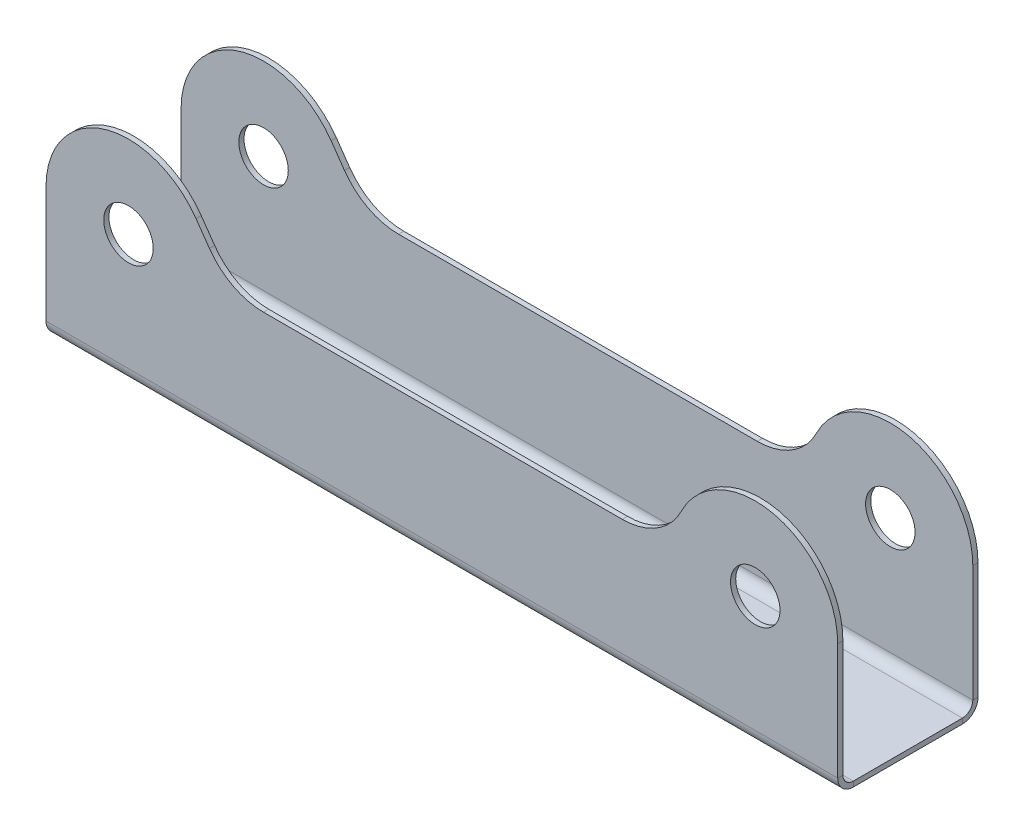
ISO-10303-21;
HEADER;
FILE_DESCRIPTION(('STEP AP214'),'2;1');
FILE_NAME('part.step','',(''),(''),'','','');
FILE_SCHEMA(('AUTOMOTIVE_DESIGN { 1 0 10303 214 1 1 1 1 }'));
ENDSEC;
DATA;
#1=APPLICATION_CONTEXT('core data for automotive mechanical design processes');
#2=APPLICATION_PROTOCOL_DEFINITION('international standard','automotive_design',2000,#1);
#3=PRODUCT_CONTEXT('',#1,'mechanical');
#4=PRODUCT('Part','Part','',(#3));
#5=PRODUCT_RELATED_PRODUCT_CATEGORY('part','',(#4));
#6=PRODUCT_DEFINITION_FORMATION('','',#4);
#7=PRODUCT_DEFINITION_CONTEXT('part definition',#1,'design');
#8=PRODUCT_DEFINITION('design','',#6,#7);
#9=PRODUCT_DEFINITION_SHAPE('','',#8);
#10=(LENGTH_UNIT() NAMED_UNIT(*) SI_UNIT(.MILLI.,.METRE.));
#11=(NAMED_UNIT(*) PLANE_ANGLE_UNIT() SI_UNIT($,.RADIAN.));
#12=(NAMED_UNIT(*) SI_UNIT($,.STERADIAN.) SOLID_ANGLE_UNIT());
#13=UNCERTAINTY_MEASURE_WITH_UNIT(LENGTH_MEASURE(1.E-05),#10,'distance_accuracy_value','');
#14=(GEOMETRIC_REPRESENTATION_CONTEXT(3) GLOBAL_UNCERTAINTY_ASSIGNED_CONTEXT((#13)) GLOBAL_UNIT_ASSIGNED_CONTEXT((#10,
#11,#12)) REPRESENTATION_CONTEXT('',''));
#15=CARTESIAN_POINT('',(0.,0.,0.));
#16=DIRECTION('',(0.,0.,1.));
#17=DIRECTION('',(1.,0.,0.));
#18=AXIS2_PLACEMENT_3D('',#15,#16,#17);
#19=CARTESIAN_POINT('',(120.65,0.,-13.5));
#20=DIRECTION('',(0.,0.,1.));
#21=DIRECTION('',(1.,0.,0.));
#22=AXIS2_PLACEMENT_3D('',#19,#20,#21);
#23=CYLINDRICAL_SURFACE('',#22,4.76250000000001);
#24=CARTESIAN_POINT('',(120.65,0.,-13.5));
#25=DIRECTION('',(0.,0.,1.));
#26=DIRECTION('',(1.,0.,0.));
#27=AXIS2_PLACEMENT_3D('',#24,#25,#26);
#28=CIRCLE('',#27,4.76250000000001);
#29=CARTESIAN_POINT('',(125.4125,0.,-13.5));
#30=VERTEX_POINT('',#29);
#31=EDGE_CURVE('E273',#30,#30,#28,.T.);
#32=ORIENTED_EDGE('',*,*,#31,.F.);
#33=EDGE_LOOP('',(#32));
#34=FACE_BOUND('',#33,.T.);
#35=CARTESIAN_POINT('',(120.65,0.,-12.5));
#36=DIRECTION('',(0.,0.,-1.));
#37=DIRECTION('',(-1.,0.,0.));
#38=AXIS2_PLACEMENT_3D('',#35,#36,#37);
#39=CIRCLE('',#38,4.76250000000001);
#40=CARTESIAN_POINT('',(115.8875,0.,-12.5));
#41=VERTEX_POINT('',#40);
#42=EDGE_CURVE('E304',#41,#41,#39,.T.);
#43=ORIENTED_EDGE('',*,*,#42,.F.);
#44=EDGE_LOOP('',(#43));
#45=FACE_BOUND('',#44,.T.);
#46=ADVANCED_FACE('F34',(#34,#45),#23,.F.);
#47=CARTESIAN_POINT('',(0.,0.,-13.5));
#48=DIRECTION('',(0.,0.,-1.));
#49=DIRECTION('',(-1.,0.,0.));
#50=AXIS2_PLACEMENT_3D('',#47,#48,#49);
#51=PLANE('',#50);
#52=DIRECTION('',(1.,0.,0.));
#53=VECTOR('',#52,1.);
#54=CARTESIAN_POINT('',(136.525,-22.4,-13.5));
#55=LINE('',#54,#53);
#56=CARTESIAN_POINT('',(-15.875,-22.4,-13.5));
#57=VERTEX_POINT('',#56);
#58=CARTESIAN_POINT('',(136.525,-22.4,-13.5));
#59=VERTEX_POINT('',#58);
#60=EDGE_CURVE('E198',#57,#59,#55,.T.);
#61=ORIENTED_EDGE('',*,*,#60,.F.);
#62=DIRECTION('',(0.,-1.,0.));
#63=VECTOR('',#62,1.);
#64=CARTESIAN_POINT('',(-15.875,0.,-13.5));
#65=LINE('',#64,#63);
#66=CARTESIAN_POINT('',(-15.875,0.,-13.5));
#67=VERTEX_POINT('',#66);
#68=EDGE_CURVE('E212',#67,#57,#65,.T.);
#69=ORIENTED_EDGE('',*,*,#68,.F.);
#70=CARTESIAN_POINT('',(0.,0.,-13.5));
#71=DIRECTION('',(0.,0.,-1.));
#72=DIRECTION('',(-1.,0.,0.));
#73=AXIS2_PLACEMENT_3D('',#70,#71,#72);
#74=CIRCLE('',#73,15.875);
#75=CARTESIAN_POINT('',(13.0040387030877,9.10552592707292,-13.5));
#76=VERTEX_POINT('',#75);
#77=EDGE_CURVE('E270',#67,#76,#74,.T.);
#78=ORIENTED_EDGE('',*,*,#77,.T.);
#79=DIRECTION('',(0.57357643635105,-0.819152044288989,0.));
#80=VECTOR('',#79,1.);
#81=CARTESIAN_POINT('',(13.0040387030877,9.10552592707292,-13.5));
#82=LINE('',#81,#80);
#83=CARTESIAN_POINT('',(15.5877671761251,5.41557925834168,-13.5));
#84=VERTEX_POINT('',#83);
#85=EDGE_CURVE('E266',#76,#84,#82,.T.);
#86=ORIENTED_EDGE('',*,*,#85,.T.);
#87=CARTESIAN_POINT('',(25.9909981385953,12.7,-13.5));
#88=DIRECTION('',(0.,0.,-1.));
#89=DIRECTION('',(-1.,0.,0.));
#90=AXIS2_PLACEMENT_3D('',#87,#88,#89);
#91=CIRCLE('',#90,12.7);
#92=CARTESIAN_POINT('',(25.9909981385953,0.,-13.5));
#93=VERTEX_POINT('',#92);
#94=EDGE_CURVE('E263',#84,#93,#91,.F.);
#95=ORIENTED_EDGE('',*,*,#94,.T.);
#96=DIRECTION('',(-1.,0.,0.));
#97=VECTOR('',#96,1.);
#98=CARTESIAN_POINT('',(103.756177861945,0.,-13.5));
#99=LINE('',#98,#97);
#100=CARTESIAN_POINT('',(95.0523316491521,0.,-13.5));
#101=VERTEX_POINT('',#100);
#102=EDGE_CURVE('E258',#101,#93,#99,.T.);
#103=ORIENTED_EDGE('',*,*,#102,.F.);
#104=CARTESIAN_POINT('',(95.0523316491521,12.7,-13.5));
#105=DIRECTION('',(0.,0.,-1.));
#106=DIRECTION('',(-1.,0.,0.));
#107=AXIS2_PLACEMENT_3D('',#104,#105,#106);
#108=CIRCLE('',#107,12.7);
#109=CARTESIAN_POINT('',(106.429073138418,7.05555555555557,-13.5));
#110=VERTEX_POINT('',#109);
#111=EDGE_CURVE('E251',#101,#110,#108,.F.);
#112=ORIENTED_EDGE('',*,*,#111,.T.);
#113=CARTESIAN_POINT('',(120.65,0.,-13.5));
#114=DIRECTION('',(0.,0.,1.));
#115=DIRECTION('',(1.,0.,0.));
#116=AXIS2_PLACEMENT_3D('',#113,#114,#115);
#117=CIRCLE('',#116,15.875);
#118=CARTESIAN_POINT('',(136.525,0.,-13.5));
#119=VERTEX_POINT('',#118);
#120=EDGE_CURVE('E55',#119,#110,#117,.T.);
#121=ORIENTED_EDGE('',*,*,#120,.F.);
#122=DIRECTION('',(0.,1.,0.));
#123=VECTOR('',#122,1.);
#124=CARTESIAN_POINT('',(136.525,-25.4,-13.5));
#125=LINE('',#124,#123);
#126=EDGE_CURVE('E48',#59,#119,#125,.T.);
#127=ORIENTED_EDGE('',*,*,#126,.F.);
#128=EDGE_LOOP('',(#61,#69,#78,#86,#95,#103,#112,#121,#127));
#129=FACE_BOUND('',#128,.T.);
#130=CARTESIAN_POINT('',(0.,0.,-13.5));
#131=DIRECTION('',(0.,0.,1.));
#132=DIRECTION('',(1.,0.,0.));
#133=AXIS2_PLACEMENT_3D('',#130,#131,#132);
#134=CIRCLE('',#133,4.7625);
#135=CARTESIAN_POINT('',(4.7625,0.,-13.5));
#136=VERTEX_POINT('',#135);
#137=EDGE_CURVE('E276',#136,#136,#134,.T.);
#138=ORIENTED_EDGE('',*,*,#137,.T.);
#139=EDGE_LOOP('',(#138));
#140=FACE_BOUND('',#139,.T.);
#141=ORIENTED_EDGE('',*,*,#31,.T.);
#142=EDGE_LOOP('',(#141));
#143=FACE_BOUND('',#142,.T.);
#144=ADVANCED_FACE('F221',(#129,#140,#143),#51,.T.);
#145=CARTESIAN_POINT('',(0.,0.,-13.5));
#146=DIRECTION('',(0.,0.,1.));
#147=DIRECTION('',(1.,0.,0.));
#148=AXIS2_PLACEMENT_3D('',#145,#146,#147);
#149=CYLINDRICAL_SURFACE('',#148,4.7625);
#150=ORIENTED_EDGE('',*,*,#137,.F.);
#151=EDGE_LOOP('',(#150));
#152=FACE_BOUND('',#151,.T.);
#153=CARTESIAN_POINT('',(0.,0.,-12.5));
#154=DIRECTION('',(0.,0.,-1.));
#155=DIRECTION('',(-1.,0.,0.));
#156=AXIS2_PLACEMENT_3D('',#153,#154,#155);
#157=CIRCLE('',#156,4.7625);
#158=CARTESIAN_POINT('',(-4.7625,0.,-12.5));
#159=VERTEX_POINT('',#158);
#160=EDGE_CURVE('E307',#159,#159,#157,.T.);
#161=ORIENTED_EDGE('',*,*,#160,.F.);
#162=EDGE_LOOP('',(#161));
#163=FACE_BOUND('',#162,.T.);
#164=ADVANCED_FACE('F538',(#152,#163),#149,.F.);
#165=CARTESIAN_POINT('',(0.,0.,-12.5));
#166=DIRECTION('',(0.,0.,-1.));
#167=DIRECTION('',(-1.,0.,0.));
#168=AXIS2_PLACEMENT_3D('',#165,#166,#167);
#169=PLANE('',#168);
#170=ORIENTED_EDGE('',*,*,#160,.T.);
#171=EDGE_LOOP('',(#170));
#172=FACE_BOUND('',#171,.T.);
#173=ORIENTED_EDGE('',*,*,#42,.T.);
#174=EDGE_LOOP('',(#173));
#175=FACE_BOUND('',#174,.T.);
#176=DIRECTION('',(0.,-1.,0.));
#177=VECTOR('',#176,1.);
#178=CARTESIAN_POINT('',(-15.875,0.,-12.5));
#179=LINE('',#178,#177);
#180=CARTESIAN_POINT('',(-15.875,0.,-12.5));
#181=VERTEX_POINT('',#180);
#182=CARTESIAN_POINT('',(-15.875,-22.4,-12.5));
#183=VERTEX_POINT('',#182);
#184=EDGE_CURVE('E297',#181,#183,#179,.T.);
#185=ORIENTED_EDGE('',*,*,#184,.T.);
#186=DIRECTION('',(1.,0.,0.));
#187=VECTOR('',#186,1.);
#188=CARTESIAN_POINT('',(136.525,-22.4,-12.5));
#189=LINE('',#188,#187);
#190=CARTESIAN_POINT('',(136.525,-22.4,-12.5));
#191=VERTEX_POINT('',#190);
#192=EDGE_CURVE('E219',#183,#191,#189,.T.);
#193=ORIENTED_EDGE('',*,*,#192,.T.);
#194=DIRECTION('',(0.,1.,0.));
#195=VECTOR('',#194,1.);
#196=CARTESIAN_POINT('',(136.525,0.,-12.5));
#197=LINE('',#196,#195);
#198=CARTESIAN_POINT('',(136.525,0.,-12.5));
#199=VERTEX_POINT('',#198);
#200=EDGE_CURVE('E294',#191,#199,#197,.T.);
#201=ORIENTED_EDGE('',*,*,#200,.T.);
#202=CARTESIAN_POINT('',(120.65,0.,-12.5));
#203=DIRECTION('',(0.,0.,-1.));
#204=DIRECTION('',(-1.,0.,0.));
#205=AXIS2_PLACEMENT_3D('',#202,#203,#204);
#206=CIRCLE('',#205,15.875);
#207=CARTESIAN_POINT('',(106.429073138418,7.05555555555557,-12.5));
#208=VERTEX_POINT('',#207);
#209=EDGE_CURVE('E247',#199,#208,#206,.F.);
#210=ORIENTED_EDGE('',*,*,#209,.T.);
#211=CARTESIAN_POINT('',(95.0523316491521,12.7,-12.5));
#212=DIRECTION('',(0.,0.,-1.));
#213=DIRECTION('',(-1.,0.,0.));
#214=AXIS2_PLACEMENT_3D('',#211,#212,#213);
#215=CIRCLE('',#214,12.7);
#216=CARTESIAN_POINT('',(95.0523316491521,0.,-12.5));
#217=VERTEX_POINT('',#216);
#218=EDGE_CURVE('E289',#217,#208,#215,.F.);
#219=ORIENTED_EDGE('',*,*,#218,.F.);
#220=DIRECTION('',(-1.,0.,0.));
#221=VECTOR('',#220,1.);
#222=CARTESIAN_POINT('',(0.,0.,-12.5));
#223=LINE('',#222,#221);
#224=CARTESIAN_POINT('',(25.9909981385953,0.,-12.5));
#225=VERTEX_POINT('',#224);
#226=EDGE_CURVE('E287',#217,#225,#223,.T.);
#227=ORIENTED_EDGE('',*,*,#226,.T.);
#228=CARTESIAN_POINT('',(25.9909981385953,12.7,-12.5));
#229=DIRECTION('',(0.,0.,-1.));
#230=DIRECTION('',(-1.,0.,0.));
#231=AXIS2_PLACEMENT_3D('',#228,#229,#230);
#232=CIRCLE('',#231,12.7);
#233=CARTESIAN_POINT('',(15.5877671761251,5.41557925834168,-12.5));
#234=VERTEX_POINT('',#233);
#235=EDGE_CURVE('E283',#234,#225,#232,.F.);
#236=ORIENTED_EDGE('',*,*,#235,.F.);
#237=DIRECTION('',(0.57357643635105,-0.819152044288989,0.));
#238=VECTOR('',#237,1.);
#239=CARTESIAN_POINT('',(13.0040387030877,9.10552592707292,-12.5));
#240=LINE('',#239,#238);
#241=CARTESIAN_POINT('',(13.0040387030877,9.10552592707292,-12.5));
#242=VERTEX_POINT('',#241);
#243=EDGE_CURVE('E279',#242,#234,#240,.T.);
#244=ORIENTED_EDGE('',*,*,#243,.F.);
#245=CARTESIAN_POINT('',(0.,0.,-12.5));
#246=DIRECTION('',(0.,0.,-1.));
#247=DIRECTION('',(-1.,0.,0.));
#248=AXIS2_PLACEMENT_3D('',#245,#246,#247);
#249=CIRCLE('',#248,15.875);
#250=EDGE_CURVE('E300',#181,#242,#249,.T.);
#251=ORIENTED_EDGE('',*,*,#250,.F.);
#252=EDGE_LOOP('',(#185,#193,#201,#210,#219,#227,#236,#244,#251));
#253=FACE_BOUND('',#252,.T.);
#254=ADVANCED_FACE('F521',(#172,#175,#253),#169,.F.);
#255=CARTESIAN_POINT('',(136.525,0.,301.765719575012));
#256=DIRECTION('',(-1.,0.,0.));
#257=DIRECTION('',(0.,-1.,0.));
#258=AXIS2_PLACEMENT_3D('',#255,#256,#257);
#259=PLANE('',#258);
#260=ORIENTED_EDGE('',*,*,#126,.T.);
#261=DIRECTION('',(0.,0.,-1.));
#262=VECTOR('',#261,1.);
#263=CARTESIAN_POINT('',(136.525,0.,301.765719575012));
#264=LINE('',#263,#262);
#265=EDGE_CURVE('E42',#199,#119,#264,.T.);
#266=ORIENTED_EDGE('',*,*,#265,.F.);
#267=ORIENTED_EDGE('',*,*,#200,.F.);
#268=DIRECTION('',(0.,0.,-1.));
#269=VECTOR('',#268,1.);
#270=CARTESIAN_POINT('',(136.525,-22.4,301.765719575012));
#271=LINE('',#270,#269);
#272=EDGE_CURVE('E11',#191,#59,#271,.T.);
#273=ORIENTED_EDGE('',*,*,#272,.T.);
#274=EDGE_LOOP('',(#260,#266,#267,#273));
#275=FACE_BOUND('',#274,.T.);
#276=ADVANCED_FACE('F36',(#275),#259,.F.);
#277=CARTESIAN_POINT('',(120.65,0.,301.765719575012));
#278=DIRECTION('',(0.,0.,-1.));
#279=DIRECTION('',(0.,1.,0.));
#280=AXIS2_PLACEMENT_3D('',#277,#278,#279);
#281=CYLINDRICAL_SURFACE('',#280,15.875);
#282=ORIENTED_EDGE('',*,*,#120,.T.);
#283=DIRECTION('',(0.,0.,-1.));
#284=VECTOR('',#283,1.);
#285=CARTESIAN_POINT('',(106.429073138418,7.05555555555557,301.765719575012));
#286=LINE('',#285,#284);
#287=EDGE_CURVE('E244',#208,#110,#286,.T.);
#288=ORIENTED_EDGE('',*,*,#287,.F.);
#289=ORIENTED_EDGE('',*,*,#209,.F.);
#290=ORIENTED_EDGE('',*,*,#265,.T.);
#291=EDGE_LOOP('',(#282,#288,#289,#290));
#292=FACE_BOUND('',#291,.T.);
#293=ADVANCED_FACE('F246',(#292),#281,.T.);
#294=CARTESIAN_POINT('',(95.0523316491521,12.7,301.765719575012));
#295=DIRECTION('',(0.,0.,-1.));
#296=DIRECTION('',(0.,1.,0.));
#297=AXIS2_PLACEMENT_3D('',#294,#295,#296);
#298=CYLINDRICAL_SURFACE('',#297,12.7);
#299=ORIENTED_EDGE('',*,*,#287,.T.);
#300=ORIENTED_EDGE('',*,*,#111,.F.);
#301=DIRECTION('',(0.,0.,-1.));
#302=VECTOR('',#301,1.);
#303=CARTESIAN_POINT('',(95.0523316491521,0.,301.765719575012));
#304=LINE('',#303,#302);
#305=EDGE_CURVE('E241',#217,#101,#304,.T.);
#306=ORIENTED_EDGE('',*,*,#305,.F.);
#307=ORIENTED_EDGE('',*,*,#218,.T.);
#308=EDGE_LOOP('',(#299,#300,#306,#307));
#309=FACE_BOUND('',#308,.T.);
#310=ADVANCED_FACE('F562',(#309),#298,.F.);
#311=CARTESIAN_POINT('',(0.,0.,301.765719575012));
#312=DIRECTION('',(0.,-1.,0.));
#313=DIRECTION('',(1.,0.,0.));
#314=AXIS2_PLACEMENT_3D('',#311,#312,#313);
#315=PLANE('',#314);
#316=ORIENTED_EDGE('',*,*,#102,.T.);
#317=DIRECTION('',(0.,0.,-1.));
#318=VECTOR('',#317,1.);
#319=CARTESIAN_POINT('',(25.9909981385953,0.,301.765719575012));
#320=LINE('',#319,#318);
#321=EDGE_CURVE('E238',#225,#93,#320,.T.);
#322=ORIENTED_EDGE('',*,*,#321,.F.);
#323=ORIENTED_EDGE('',*,*,#226,.F.);
#324=ORIENTED_EDGE('',*,*,#305,.T.);
#325=EDGE_LOOP('',(#316,#322,#323,#324));
#326=FACE_BOUND('',#325,.T.);
#327=ADVANCED_FACE('F558',(#326),#315,.F.);
#328=CARTESIAN_POINT('',(25.9909981385953,12.7,301.765719575012));
#329=DIRECTION('',(0.,0.,-1.));
#330=DIRECTION('',(0.,1.,0.));
#331=AXIS2_PLACEMENT_3D('',#328,#329,#330);
#332=CYLINDRICAL_SURFACE('',#331,12.7);
#333=ORIENTED_EDGE('',*,*,#321,.T.);
#334=ORIENTED_EDGE('',*,*,#94,.F.);
#335=DIRECTION('',(0.,0.,-1.));
#336=VECTOR('',#335,1.);
#337=CARTESIAN_POINT('',(15.5877671761251,5.41557925834168,301.765719575012));
#338=LINE('',#337,#336);
#339=EDGE_CURVE('E235',#234,#84,#338,.T.);
#340=ORIENTED_EDGE('',*,*,#339,.F.);
#341=ORIENTED_EDGE('',*,*,#235,.T.);
#342=EDGE_LOOP('',(#333,#334,#340,#341));
#343=FACE_BOUND('',#342,.T.);
#344=ADVANCED_FACE('F554',(#343),#332,.F.);
#345=CARTESIAN_POINT('',(13.0040387030877,9.10552592707292,301.765719575012));
#346=DIRECTION('',(0.819152044288989,0.57357643635105,0.));
#347=DIRECTION('',(-0.57357643635105,0.819152044288989,0.));
#348=AXIS2_PLACEMENT_3D('',#345,#346,#347);
#349=PLANE('',#348);
#350=ORIENTED_EDGE('',*,*,#339,.T.);
#351=ORIENTED_EDGE('',*,*,#85,.F.);
#352=DIRECTION('',(0.,0.,-1.));
#353=VECTOR('',#352,1.);
#354=CARTESIAN_POINT('',(13.0040387030877,9.10552592707292,301.765719575012));
#355=LINE('',#354,#353);
#356=EDGE_CURVE('E232',#242,#76,#355,.T.);
#357=ORIENTED_EDGE('',*,*,#356,.F.);
#358=ORIENTED_EDGE('',*,*,#243,.T.);
#359=EDGE_LOOP('',(#350,#351,#357,#358));
#360=FACE_BOUND('',#359,.T.);
#361=ADVANCED_FACE('F550',(#360),#349,.T.);
#362=CARTESIAN_POINT('',(0.,0.,301.765719575012));
#363=DIRECTION('',(0.,0.,-1.));
#364=DIRECTION('',(0.,1.,0.));
#365=AXIS2_PLACEMENT_3D('',#362,#363,#364);
#366=CYLINDRICAL_SURFACE('',#365,15.875);
#367=ORIENTED_EDGE('',*,*,#356,.T.);
#368=ORIENTED_EDGE('',*,*,#77,.F.);
#369=DIRECTION('',(0.,0.,-1.));
#370=VECTOR('',#369,1.);
#371=CARTESIAN_POINT('',(-15.875,0.,301.765719575012));
#372=LINE('',#371,#370);
#373=EDGE_CURVE('E197',#181,#67,#372,.T.);
#374=ORIENTED_EDGE('',*,*,#373,.F.);
#375=ORIENTED_EDGE('',*,*,#250,.T.);
#376=EDGE_LOOP('',(#367,#368,#374,#375));
#377=FACE_BOUND('',#376,.T.);
#378=ADVANCED_FACE('F547',(#377),#366,.T.);
#379=CARTESIAN_POINT('',(-15.875,0.,301.765719575012));
#380=DIRECTION('',(1.,0.,0.));
#381=DIRECTION('',(0.,1.,0.));
#382=AXIS2_PLACEMENT_3D('',#379,#380,#381);
#383=PLANE('',#382);
#384=ORIENTED_EDGE('',*,*,#68,.T.);
#385=DIRECTION('',(0.,0.,-1.));
#386=VECTOR('',#385,1.);
#387=CARTESIAN_POINT('',(-15.875,-22.4,301.765719575012));
#388=LINE('',#387,#386);
#389=EDGE_CURVE('E186',#183,#57,#388,.T.);
#390=ORIENTED_EDGE('',*,*,#389,.F.);
#391=ORIENTED_EDGE('',*,*,#184,.F.);
#392=ORIENTED_EDGE('',*,*,#373,.T.);
#393=EDGE_LOOP('',(#384,#390,#391,#392));
#394=FACE_BOUND('',#393,.T.);
#395=ADVANCED_FACE('F213',(#394),#383,.F.);
#396=CARTESIAN_POINT('',(120.65,0.,-13.5));
#397=DIRECTION('',(0.,0.,1.));
#398=DIRECTION('',(1.,0.,0.));
#399=AXIS2_PLACEMENT_3D('',#396,#397,#398);
#400=CYLINDRICAL_SURFACE('',#399,4.76250000000001);
#401=CARTESIAN_POINT('',(120.65,0.,12.5));
#402=DIRECTION('',(0.,0.,-1.));
#403=DIRECTION('',(-1.,0.,0.));
#404=AXIS2_PLACEMENT_3D('',#401,#402,#403);
#405=CIRCLE('',#404,4.76250000000001);
#406=CARTESIAN_POINT('',(115.8875,0.,12.5));
#407=VERTEX_POINT('',#406);
#408=EDGE_CURVE('E396',#407,#407,#405,.T.);
#409=ORIENTED_EDGE('',*,*,#408,.T.);
#410=EDGE_LOOP('',(#409));
#411=FACE_BOUND('',#410,.T.);
#412=CARTESIAN_POINT('',(120.65,0.,13.5));
#413=DIRECTION('',(0.,0.,1.));
#414=DIRECTION('',(1.,0.,0.));
#415=AXIS2_PLACEMENT_3D('',#412,#413,#414);
#416=CIRCLE('',#415,4.76250000000001);
#417=CARTESIAN_POINT('',(125.4125,0.,13.5));
#418=VERTEX_POINT('',#417);
#419=EDGE_CURVE('E368',#418,#418,#416,.T.);
#420=ORIENTED_EDGE('',*,*,#419,.T.);
#421=EDGE_LOOP('',(#420));
#422=FACE_BOUND('',#421,.T.);
#423=ADVANCED_FACE('F546',(#411,#422),#400,.F.);
#424=CARTESIAN_POINT('',(0.,0.,13.5));
#425=DIRECTION('',(0.,0.,-1.));
#426=DIRECTION('',(-1.,0.,0.));
#427=AXIS2_PLACEMENT_3D('',#424,#425,#426);
#428=PLANE('',#427);
#429=CARTESIAN_POINT('',(0.,0.,13.5));
#430=DIRECTION('',(0.,0.,1.));
#431=DIRECTION('',(1.,0.,0.));
#432=AXIS2_PLACEMENT_3D('',#429,#430,#431);
#433=CIRCLE('',#432,4.7625);
#434=CARTESIAN_POINT('',(4.7625,0.,13.5));
#435=VERTEX_POINT('',#434);
#436=EDGE_CURVE('E371',#435,#435,#433,.T.);
#437=ORIENTED_EDGE('',*,*,#436,.F.);
#438=EDGE_LOOP('',(#437));
#439=FACE_BOUND('',#438,.T.);
#440=ORIENTED_EDGE('',*,*,#419,.F.);
#441=EDGE_LOOP('',(#440));
#442=FACE_BOUND('',#441,.T.);
#443=DIRECTION('',(0.,-1.,0.));
#444=VECTOR('',#443,1.);
#445=CARTESIAN_POINT('',(-15.875,0.,13.5));
#446=LINE('',#445,#444);
#447=CARTESIAN_POINT('',(-15.875,0.,13.5));
#448=VERTEX_POINT('',#447);
#449=CARTESIAN_POINT('',(-15.875,-22.4,13.5));
#450=VERTEX_POINT('',#449);
#451=EDGE_CURVE('E362',#448,#450,#446,.T.);
#452=ORIENTED_EDGE('',*,*,#451,.T.);
#453=DIRECTION('',(1.,0.,0.));
#454=VECTOR('',#453,1.);
#455=CARTESIAN_POINT('',(-15.875,-22.4,13.5));
#456=LINE('',#455,#454);
#457=CARTESIAN_POINT('',(136.525,-22.4,13.5));
#458=VERTEX_POINT('',#457);
#459=EDGE_CURVE('E341',#450,#458,#456,.T.);
#460=ORIENTED_EDGE('',*,*,#459,.T.);
#461=DIRECTION('',(0.,1.,0.));
#462=VECTOR('',#461,1.);
#463=CARTESIAN_POINT('',(136.525,0.,13.5));
#464=LINE('',#463,#462);
#465=CARTESIAN_POINT('',(136.525,0.,13.5));
#466=VERTEX_POINT('',#465);
#467=EDGE_CURVE('E310',#458,#466,#464,.T.);
#468=ORIENTED_EDGE('',*,*,#467,.T.);
#469=CARTESIAN_POINT('',(120.65,0.,13.5));
#470=DIRECTION('',(0.,0.,1.));
#471=DIRECTION('',(1.,0.,0.));
#472=AXIS2_PLACEMENT_3D('',#469,#470,#471);
#473=CIRCLE('',#472,15.875);
#474=CARTESIAN_POINT('',(106.429073138418,7.05555555555557,13.5));
#475=VERTEX_POINT('',#474);
#476=EDGE_CURVE('E359',#466,#475,#473,.T.);
#477=ORIENTED_EDGE('',*,*,#476,.T.);
#478=CARTESIAN_POINT('',(95.0523316491521,12.7,13.5));
#479=DIRECTION('',(0.,0.,-1.));
#480=DIRECTION('',(-1.,0.,0.));
#481=AXIS2_PLACEMENT_3D('',#478,#479,#480);
#482=CIRCLE('',#481,12.7);
#483=CARTESIAN_POINT('',(95.0523316491521,0.,13.5));
#484=VERTEX_POINT('',#483);
#485=EDGE_CURVE('E356',#475,#484,#482,.T.);
#486=ORIENTED_EDGE('',*,*,#485,.T.);
#487=DIRECTION('',(-1.,0.,0.));
#488=VECTOR('',#487,1.);
#489=CARTESIAN_POINT('',(103.756177861945,0.,13.5));
#490=LINE('',#489,#488);
#491=CARTESIAN_POINT('',(25.9909981385953,0.,13.5));
#492=VERTEX_POINT('',#491);
#493=EDGE_CURVE('E353',#484,#492,#490,.T.);
#494=ORIENTED_EDGE('',*,*,#493,.T.);
#495=CARTESIAN_POINT('',(25.9909981385953,12.7,13.5));
#496=DIRECTION('',(0.,0.,-1.));
#497=DIRECTION('',(-1.,0.,0.));
#498=AXIS2_PLACEMENT_3D('',#495,#496,#497);
#499=CIRCLE('',#498,12.7);
#500=CARTESIAN_POINT('',(15.5877671761251,5.41557925834168,13.5));
#501=VERTEX_POINT('',#500);
#502=EDGE_CURVE('E350',#492,#501,#499,.T.);
#503=ORIENTED_EDGE('',*,*,#502,.T.);
#504=DIRECTION('',(0.57357643635105,-0.819152044288989,0.));
#505=VECTOR('',#504,1.);
#506=CARTESIAN_POINT('',(13.0040387030877,9.10552592707292,13.5));
#507=LINE('',#506,#505);
#508=CARTESIAN_POINT('',(13.0040387030877,9.10552592707292,13.5));
#509=VERTEX_POINT('',#508);
#510=EDGE_CURVE('E348',#509,#501,#507,.T.);
#511=ORIENTED_EDGE('',*,*,#510,.F.);
#512=CARTESIAN_POINT('',(0.,0.,13.5));
#513=DIRECTION('',(0.,0.,-1.));
#514=DIRECTION('',(-1.,0.,0.));
#515=AXIS2_PLACEMENT_3D('',#512,#513,#514);
#516=CIRCLE('',#515,15.875);
#517=EDGE_CURVE('E365',#448,#509,#516,.T.);
#518=ORIENTED_EDGE('',*,*,#517,.F.);
#519=EDGE_LOOP('',(#452,#460,#468,#477,#486,#494,#503,#511,#518));
#520=FACE_BOUND('',#519,.T.);
#521=ADVANCED_FACE('F489',(#439,#442,#520),#428,.F.);
#522=CARTESIAN_POINT('',(0.,0.,-13.5));
#523=DIRECTION('',(0.,0.,1.));
#524=DIRECTION('',(1.,0.,0.));
#525=AXIS2_PLACEMENT_3D('',#522,#523,#524);
#526=CYLINDRICAL_SURFACE('',#525,4.7625);
#527=CARTESIAN_POINT('',(0.,0.,12.5));
#528=DIRECTION('',(0.,0.,-1.));
#529=DIRECTION('',(-1.,0.,0.));
#530=AXIS2_PLACEMENT_3D('',#527,#528,#529);
#531=CIRCLE('',#530,4.7625);
#532=CARTESIAN_POINT('',(-4.7625,0.,12.5));
#533=VERTEX_POINT('',#532);
#534=EDGE_CURVE('E399',#533,#533,#531,.T.);
#535=ORIENTED_EDGE('',*,*,#534,.T.);
#536=EDGE_LOOP('',(#535));
#537=FACE_BOUND('',#536,.T.);
#538=ORIENTED_EDGE('',*,*,#436,.T.);
#539=EDGE_LOOP('',(#538));
#540=FACE_BOUND('',#539,.T.);
#541=ADVANCED_FACE('F602',(#537,#540),#526,.F.);
#542=CARTESIAN_POINT('',(0.,0.,12.5));
#543=DIRECTION('',(0.,0.,-1.));
#544=DIRECTION('',(-1.,0.,0.));
#545=AXIS2_PLACEMENT_3D('',#542,#543,#544);
#546=PLANE('',#545);
#547=DIRECTION('',(1.,0.,0.));
#548=VECTOR('',#547,1.);
#549=CARTESIAN_POINT('',(-15.875,-22.4,12.5));
#550=LINE('',#549,#548);
#551=CARTESIAN_POINT('',(-15.875,-22.4,12.5));
#552=VERTEX_POINT('',#551);
#553=CARTESIAN_POINT('',(136.525,-22.4,12.5));
#554=VERTEX_POINT('',#553);
#555=EDGE_CURVE('E345',#552,#554,#550,.T.);
#556=ORIENTED_EDGE('',*,*,#555,.F.);
#557=DIRECTION('',(0.,-1.,0.));
#558=VECTOR('',#557,1.);
#559=CARTESIAN_POINT('',(-15.875,0.,12.5));
#560=LINE('',#559,#558);
#561=CARTESIAN_POINT('',(-15.875,0.,12.5));
#562=VERTEX_POINT('',#561);
#563=EDGE_CURVE('E374',#562,#552,#560,.T.);
#564=ORIENTED_EDGE('',*,*,#563,.F.);
#565=CARTESIAN_POINT('',(0.,0.,12.5));
#566=DIRECTION('',(0.,0.,-1.));
#567=DIRECTION('',(-1.,0.,0.));
#568=AXIS2_PLACEMENT_3D('',#565,#566,#567);
#569=CIRCLE('',#568,15.875);
#570=CARTESIAN_POINT('',(13.0040387030877,9.10552592707292,12.5));
#571=VERTEX_POINT('',#570);
#572=EDGE_CURVE('E394',#562,#571,#569,.T.);
#573=ORIENTED_EDGE('',*,*,#572,.T.);
#574=DIRECTION('',(0.57357643635105,-0.819152044288989,0.));
#575=VECTOR('',#574,1.);
#576=CARTESIAN_POINT('',(13.0040387030877,9.10552592707292,12.5));
#577=LINE('',#576,#575);
#578=CARTESIAN_POINT('',(15.5877671761251,5.41557925834168,12.5));
#579=VERTEX_POINT('',#578);
#580=EDGE_CURVE('E391',#571,#579,#577,.T.);
#581=ORIENTED_EDGE('',*,*,#580,.T.);
#582=CARTESIAN_POINT('',(25.9909981385953,12.7,12.5));
#583=DIRECTION('',(0.,0.,-1.));
#584=DIRECTION('',(-1.,0.,0.));
#585=AXIS2_PLACEMENT_3D('',#582,#583,#584);
#586=CIRCLE('',#585,12.7);
#587=CARTESIAN_POINT('',(25.9909981385953,0.,12.5));
#588=VERTEX_POINT('',#587);
#589=EDGE_CURVE('E388',#588,#579,#586,.T.);
#590=ORIENTED_EDGE('',*,*,#589,.F.);
#591=DIRECTION('',(-1.,0.,0.));
#592=VECTOR('',#591,1.);
#593=CARTESIAN_POINT('',(0.,0.,12.5));
#594=LINE('',#593,#592);
#595=CARTESIAN_POINT('',(95.0523316491521,0.,12.5));
#596=VERTEX_POINT('',#595);
#597=EDGE_CURVE('E384',#596,#588,#594,.T.);
#598=ORIENTED_EDGE('',*,*,#597,.F.);
#599=CARTESIAN_POINT('',(95.0523316491521,12.7,12.5));
#600=DIRECTION('',(0.,0.,-1.));
#601=DIRECTION('',(-1.,0.,0.));
#602=AXIS2_PLACEMENT_3D('',#599,#600,#601);
#603=CIRCLE('',#602,12.7);
#604=CARTESIAN_POINT('',(106.429073138418,7.05555555555557,12.5));
#605=VERTEX_POINT('',#604);
#606=EDGE_CURVE('E381',#605,#596,#603,.T.);
#607=ORIENTED_EDGE('',*,*,#606,.F.);
#608=CARTESIAN_POINT('',(120.65,0.,12.5));
#609=DIRECTION('',(0.,0.,-1.));
#610=DIRECTION('',(-1.,0.,0.));
#611=AXIS2_PLACEMENT_3D('',#608,#609,#610);
#612=CIRCLE('',#611,15.875);
#613=CARTESIAN_POINT('',(136.525,0.,12.5));
#614=VERTEX_POINT('',#613);
#615=EDGE_CURVE('E378',#614,#605,#612,.F.);
#616=ORIENTED_EDGE('',*,*,#615,.F.);
#617=DIRECTION('',(0.,1.,0.));
#618=VECTOR('',#617,1.);
#619=CARTESIAN_POINT('',(136.525,0.,12.5));
#620=LINE('',#619,#618);
#621=EDGE_CURVE('E313',#554,#614,#620,.T.);
#622=ORIENTED_EDGE('',*,*,#621,.F.);
#623=EDGE_LOOP('',(#556,#564,#573,#581,#590,#598,#607,#616,#622));
#624=FACE_BOUND('',#623,.T.);
#625=ORIENTED_EDGE('',*,*,#534,.F.);
#626=EDGE_LOOP('',(#625));
#627=FACE_BOUND('',#626,.T.);
#628=ORIENTED_EDGE('',*,*,#408,.F.);
#629=EDGE_LOOP('',(#628));
#630=FACE_BOUND('',#629,.T.);
#631=ADVANCED_FACE('F476',(#624,#627,#630),#546,.T.);
#632=CARTESIAN_POINT('',(-15.875,0.,-301.765719575012));
#633=DIRECTION('',(-1.,0.,0.));
#634=DIRECTION('',(0.,1.,0.));
#635=AXIS2_PLACEMENT_3D('',#632,#633,#634);
#636=PLANE('',#635);
#637=ORIENTED_EDGE('',*,*,#451,.F.);
#638=DIRECTION('',(0.,0.,1.));
#639=VECTOR('',#638,1.);
#640=CARTESIAN_POINT('',(-15.875,0.,-301.765719575012));
#641=LINE('',#640,#639);
#642=EDGE_CURVE('E319',#562,#448,#641,.T.);
#643=ORIENTED_EDGE('',*,*,#642,.F.);
#644=ORIENTED_EDGE('',*,*,#563,.T.);
#645=DIRECTION('',(0.,0.,1.));
#646=VECTOR('',#645,1.);
#647=CARTESIAN_POINT('',(-15.875,-22.4,-301.765719575012));
#648=LINE('',#647,#646);
#649=EDGE_CURVE('E316',#552,#450,#648,.T.);
#650=ORIENTED_EDGE('',*,*,#649,.T.);
#651=EDGE_LOOP('',(#637,#643,#644,#650));
#652=FACE_BOUND('',#651,.T.);
#653=ADVANCED_FACE('F482',(#652),#636,.T.);
#654=CARTESIAN_POINT('',(0.,0.,-301.765719575012));
#655=DIRECTION('',(0.,0.,1.));
#656=DIRECTION('',(0.,-1.,0.));
#657=AXIS2_PLACEMENT_3D('',#654,#655,#656);
#658=CYLINDRICAL_SURFACE('',#657,15.875);
#659=ORIENTED_EDGE('',*,*,#642,.T.);
#660=ORIENTED_EDGE('',*,*,#517,.T.);
#661=DIRECTION('',(0.,0.,1.));
#662=VECTOR('',#661,1.);
#663=CARTESIAN_POINT('',(13.0040387030877,9.10552592707292,-301.765719575012));
#664=LINE('',#663,#662);
#665=EDGE_CURVE('E322',#571,#509,#664,.T.);
#666=ORIENTED_EDGE('',*,*,#665,.F.);
#667=ORIENTED_EDGE('',*,*,#572,.F.);
#668=EDGE_LOOP('',(#659,#660,#666,#667));
#669=FACE_BOUND('',#668,.T.);
#670=ADVANCED_FACE('F485',(#669),#658,.T.);
#671=CARTESIAN_POINT('',(13.0040387030877,9.10552592707292,-301.765719575012));
#672=DIRECTION('',(-0.819152044288989,-0.57357643635105,0.));
#673=DIRECTION('',(-0.57357643635105,0.819152044288989,0.));
#674=AXIS2_PLACEMENT_3D('',#671,#672,#673);
#675=PLANE('',#674);
#676=ORIENTED_EDGE('',*,*,#665,.T.);
#677=ORIENTED_EDGE('',*,*,#510,.T.);
#678=DIRECTION('',(0.,0.,1.));
#679=VECTOR('',#678,1.);
#680=CARTESIAN_POINT('',(15.5877671761251,5.41557925834168,-301.765719575012));
#681=LINE('',#680,#679);
#682=EDGE_CURVE('E325',#579,#501,#681,.T.);
#683=ORIENTED_EDGE('',*,*,#682,.F.);
#684=ORIENTED_EDGE('',*,*,#580,.F.);
#685=EDGE_LOOP('',(#676,#677,#683,#684));
#686=FACE_BOUND('',#685,.T.);
#687=ADVANCED_FACE('F492',(#686),#675,.F.);
#688=CARTESIAN_POINT('',(25.9909981385953,12.7,-301.765719575012));
#689=DIRECTION('',(0.,0.,1.));
#690=DIRECTION('',(0.,-1.,0.));
#691=AXIS2_PLACEMENT_3D('',#688,#689,#690);
#692=CYLINDRICAL_SURFACE('',#691,12.7);
#693=ORIENTED_EDGE('',*,*,#502,.F.);
#694=DIRECTION('',(0.,0.,1.));
#695=VECTOR('',#694,1.);
#696=CARTESIAN_POINT('',(25.9909981385953,0.,-301.765719575012));
#697=LINE('',#696,#695);
#698=EDGE_CURVE('E328',#588,#492,#697,.T.);
#699=ORIENTED_EDGE('',*,*,#698,.F.);
#700=ORIENTED_EDGE('',*,*,#589,.T.);
#701=ORIENTED_EDGE('',*,*,#682,.T.);
#702=EDGE_LOOP('',(#693,#699,#700,#701));
#703=FACE_BOUND('',#702,.T.);
#704=ADVANCED_FACE('F495',(#703),#692,.F.);
#705=CARTESIAN_POINT('',(0.,0.,-301.765719575012));
#706=DIRECTION('',(0.,1.,0.));
#707=DIRECTION('',(1.,0.,0.));
#708=AXIS2_PLACEMENT_3D('',#705,#706,#707);
#709=PLANE('',#708);
#710=ORIENTED_EDGE('',*,*,#493,.F.);
#711=DIRECTION('',(0.,0.,1.));
#712=VECTOR('',#711,1.);
#713=CARTESIAN_POINT('',(95.0523316491521,0.,-301.765719575012));
#714=LINE('',#713,#712);
#715=EDGE_CURVE('E331',#596,#484,#714,.T.);
#716=ORIENTED_EDGE('',*,*,#715,.F.);
#717=ORIENTED_EDGE('',*,*,#597,.T.);
#718=ORIENTED_EDGE('',*,*,#698,.T.);
#719=EDGE_LOOP('',(#710,#716,#717,#718));
#720=FACE_BOUND('',#719,.T.);
#721=ADVANCED_FACE('F499',(#720),#709,.T.);
#722=CARTESIAN_POINT('',(95.0523316491521,12.7,-301.765719575012));
#723=DIRECTION('',(0.,0.,1.));
#724=DIRECTION('',(0.,-1.,0.));
#725=AXIS2_PLACEMENT_3D('',#722,#723,#724);
#726=CYLINDRICAL_SURFACE('',#725,12.7);
#727=ORIENTED_EDGE('',*,*,#485,.F.);
#728=DIRECTION('',(0.,0.,1.));
#729=VECTOR('',#728,1.);
#730=CARTESIAN_POINT('',(106.429073138418,7.05555555555557,-301.765719575012));
#731=LINE('',#730,#729);
#732=EDGE_CURVE('E334',#605,#475,#731,.T.);
#733=ORIENTED_EDGE('',*,*,#732,.F.);
#734=ORIENTED_EDGE('',*,*,#606,.T.);
#735=ORIENTED_EDGE('',*,*,#715,.T.);
#736=EDGE_LOOP('',(#727,#733,#734,#735));
#737=FACE_BOUND('',#736,.T.);
#738=ADVANCED_FACE('F501',(#737),#726,.F.);
#739=CARTESIAN_POINT('',(120.65,0.,-301.765719575012));
#740=DIRECTION('',(0.,0.,1.));
#741=DIRECTION('',(0.,-1.,0.));
#742=AXIS2_PLACEMENT_3D('',#739,#740,#741);
#743=CYLINDRICAL_SURFACE('',#742,15.875);
#744=ORIENTED_EDGE('',*,*,#476,.F.);
#745=DIRECTION('',(0.,0.,1.));
#746=VECTOR('',#745,1.);
#747=CARTESIAN_POINT('',(136.525,0.,-301.765719575012));
#748=LINE('',#747,#746);
#749=EDGE_CURVE('E337',#614,#466,#748,.T.);
#750=ORIENTED_EDGE('',*,*,#749,.F.);
#751=ORIENTED_EDGE('',*,*,#615,.T.);
#752=ORIENTED_EDGE('',*,*,#732,.T.);
#753=EDGE_LOOP('',(#744,#750,#751,#752));
#754=FACE_BOUND('',#753,.T.);
#755=ADVANCED_FACE('F507',(#754),#743,.T.);
#756=CARTESIAN_POINT('',(136.525,0.,-301.765719575012));
#757=DIRECTION('',(1.,0.,0.));
#758=DIRECTION('',(0.,-1.,0.));
#759=AXIS2_PLACEMENT_3D('',#756,#757,#758);
#760=PLANE('',#759);
#761=ORIENTED_EDGE('',*,*,#467,.F.);
#762=DIRECTION('',(0.,0.,1.));
#763=VECTOR('',#762,1.);
#764=CARTESIAN_POINT('',(136.525,-22.4,-301.765719575012));
#765=LINE('',#764,#763);
#766=EDGE_CURVE('E339',#554,#458,#765,.T.);
#767=ORIENTED_EDGE('',*,*,#766,.F.);
#768=ORIENTED_EDGE('',*,*,#621,.T.);
#769=ORIENTED_EDGE('',*,*,#749,.T.);
#770=EDGE_LOOP('',(#761,#767,#768,#769));
#771=FACE_BOUND('',#770,.T.);
#772=ADVANCED_FACE('F509',(#771),#760,.T.);
#773=CARTESIAN_POINT('',(136.525,283.28009360373,13.5));
#774=DIRECTION('',(-1.,0.,0.));
#775=DIRECTION('',(0.,0.,1.));
#776=AXIS2_PLACEMENT_3D('',#773,#774,#775);
#777=PLANE('',#776);
#778=DIRECTION('',(0.,-1.,0.));
#779=VECTOR('',#778,1.);
#780=CARTESIAN_POINT('',(136.525,283.28009360373,10.5));
#781=LINE('',#780,#779);
#782=CARTESIAN_POINT('',(136.525,-24.4,10.5));
#783=VERTEX_POINT('',#782);
#784=CARTESIAN_POINT('',(136.525,-25.4,10.5));
#785=VERTEX_POINT('',#784);
#786=EDGE_CURVE('E415',#783,#785,#781,.T.);
#787=ORIENTED_EDGE('',*,*,#786,.T.);
#788=DIRECTION('',(0.,0.,-1.));
#789=VECTOR('',#788,1.);
#790=CARTESIAN_POINT('',(136.525,-25.4,13.5));
#791=LINE('',#790,#789);
#792=CARTESIAN_POINT('',(136.525,-25.4,-10.5));
#793=VERTEX_POINT('',#792);
#794=EDGE_CURVE('E434',#785,#793,#791,.T.);
#795=ORIENTED_EDGE('',*,*,#794,.T.);
#796=DIRECTION('',(0.,-1.,0.));
#797=VECTOR('',#796,1.);
#798=CARTESIAN_POINT('',(136.525,283.28009360373,-10.5));
#799=LINE('',#798,#797);
#800=CARTESIAN_POINT('',(136.525,-24.4,-10.5));
#801=VERTEX_POINT('',#800);
#802=EDGE_CURVE('E408',#801,#793,#799,.T.);
#803=ORIENTED_EDGE('',*,*,#802,.F.);
#804=DIRECTION('',(0.,0.,-1.));
#805=VECTOR('',#804,1.);
#806=CARTESIAN_POINT('',(136.525,-24.4,13.5));
#807=LINE('',#806,#805);
#808=EDGE_CURVE('E422',#783,#801,#807,.T.);
#809=ORIENTED_EDGE('',*,*,#808,.F.);
#810=EDGE_LOOP('',(#787,#795,#803,#809));
#811=FACE_BOUND('',#810,.T.);
#812=ADVANCED_FACE('F462',(#811),#777,.F.);
#813=CARTESIAN_POINT('',(-15.875,283.28009360373,13.5));
#814=DIRECTION('',(-1.,0.,0.));
#815=DIRECTION('',(0.,0.,1.));
#816=AXIS2_PLACEMENT_3D('',#813,#814,#815);
#817=PLANE('',#816);
#818=DIRECTION('',(0.,0.,-1.));
#819=VECTOR('',#818,1.);
#820=CARTESIAN_POINT('',(-15.875,-25.4,13.5));
#821=LINE('',#820,#819);
#822=CARTESIAN_POINT('',(-15.875,-25.4,10.5));
#823=VERTEX_POINT('',#822);
#824=CARTESIAN_POINT('',(-15.875,-25.4,-10.5));
#825=VERTEX_POINT('',#824);
#826=EDGE_CURVE('E432',#823,#825,#821,.T.);
#827=ORIENTED_EDGE('',*,*,#826,.F.);
#828=DIRECTION('',(0.,-1.,0.));
#829=VECTOR('',#828,1.);
#830=CARTESIAN_POINT('',(-15.875,283.28009360373,10.5));
#831=LINE('',#830,#829);
#832=CARTESIAN_POINT('',(-15.875,-24.4,10.5));
#833=VERTEX_POINT('',#832);
#834=EDGE_CURVE('E413',#833,#823,#831,.T.);
#835=ORIENTED_EDGE('',*,*,#834,.F.);
#836=DIRECTION('',(0.,0.,-1.));
#837=VECTOR('',#836,1.);
#838=CARTESIAN_POINT('',(-15.875,-24.4,13.5));
#839=LINE('',#838,#837);
#840=CARTESIAN_POINT('',(-15.875,-24.4,-10.5));
#841=VERTEX_POINT('',#840);
#842=EDGE_CURVE('E426',#833,#841,#839,.T.);
#843=ORIENTED_EDGE('',*,*,#842,.T.);
#844=DIRECTION('',(0.,-1.,0.));
#845=VECTOR('',#844,1.);
#846=CARTESIAN_POINT('',(-15.875,283.28009360373,-10.5));
#847=LINE('',#846,#845);
#848=EDGE_CURVE('E410',#841,#825,#847,.T.);
#849=ORIENTED_EDGE('',*,*,#848,.T.);
#850=EDGE_LOOP('',(#827,#835,#843,#849));
#851=FACE_BOUND('',#850,.T.);
#852=ADVANCED_FACE('F514',(#851),#817,.T.);
#853=CARTESIAN_POINT('',(-15.875,-24.4,13.5));
#854=DIRECTION('',(0.,1.,0.));
#855=DIRECTION('',(0.,0.,1.));
#856=AXIS2_PLACEMENT_3D('',#853,#854,#855);
#857=PLANE('',#856);
#858=ORIENTED_EDGE('',*,*,#808,.T.);
#859=DIRECTION('',(-1.,0.,0.));
#860=VECTOR('',#859,1.);
#861=CARTESIAN_POINT('',(136.525,-24.4,-10.5));
#862=LINE('',#861,#860);
#863=EDGE_CURVE('E418',#801,#841,#862,.T.);
#864=ORIENTED_EDGE('',*,*,#863,.T.);
#865=ORIENTED_EDGE('',*,*,#842,.F.);
#866=DIRECTION('',(1.,0.,0.));
#867=VECTOR('',#866,1.);
#868=CARTESIAN_POINT('',(-15.875,-24.4,10.5));
#869=LINE('',#868,#867);
#870=EDGE_CURVE('E404',#833,#783,#869,.T.);
#871=ORIENTED_EDGE('',*,*,#870,.T.);
#872=EDGE_LOOP('',(#858,#864,#865,#871));
#873=FACE_BOUND('',#872,.T.);
#874=ADVANCED_FACE('F613',(#873),#857,.T.);
#875=CARTESIAN_POINT('',(-15.875,-25.4,13.5));
#876=DIRECTION('',(0.,1.,0.));
#877=DIRECTION('',(0.,0.,1.));
#878=AXIS2_PLACEMENT_3D('',#875,#876,#877);
#879=PLANE('',#878);
#880=DIRECTION('',(-1.,0.,0.));
#881=VECTOR('',#880,1.);
#882=CARTESIAN_POINT('',(136.525,-25.4,-10.5));
#883=LINE('',#882,#881);
#884=EDGE_CURVE('E206',#793,#825,#883,.T.);
#885=ORIENTED_EDGE('',*,*,#884,.F.);
#886=ORIENTED_EDGE('',*,*,#794,.F.);
#887=DIRECTION('',(1.,0.,0.));
#888=VECTOR('',#887,1.);
#889=CARTESIAN_POINT('',(-15.875,-25.4,10.5));
#890=LINE('',#889,#888);
#891=EDGE_CURVE('E402',#823,#785,#890,.T.);
#892=ORIENTED_EDGE('',*,*,#891,.F.);
#893=ORIENTED_EDGE('',*,*,#826,.T.);
#894=EDGE_LOOP('',(#885,#886,#892,#893));
#895=FACE_BOUND('',#894,.T.);
#896=ADVANCED_FACE('F457',(#895),#879,.F.);
#897=CARTESIAN_POINT('',(136.525,-22.4,10.5));
#898=DIRECTION('',(1.,0.,0.));
#899=DIRECTION('',(0.,0.,-1.));
#900=AXIS2_PLACEMENT_3D('',#897,#898,#899);
#901=PLANE('',#900);
#902=ORIENTED_EDGE('',*,*,#786,.F.);
#903=CARTESIAN_POINT('',(136.525,-22.4,10.5));
#904=DIRECTION('',(1.,0.,0.));
#905=DIRECTION('',(0.,0.,-1.));
#906=AXIS2_PLACEMENT_3D('',#903,#904,#905);
#907=CIRCLE('',#906,2.);
#908=EDGE_CURVE('E439',#783,#554,#907,.F.);
#909=ORIENTED_EDGE('',*,*,#908,.T.);
#910=ORIENTED_EDGE('',*,*,#766,.T.);
#911=CARTESIAN_POINT('',(136.525,-22.4,10.5));
#912=DIRECTION('',(1.,0.,0.));
#913=DIRECTION('',(0.,0.,-1.));
#914=AXIS2_PLACEMENT_3D('',#911,#912,#913);
#915=CIRCLE('',#914,3.);
#916=EDGE_CURVE('E438',#785,#458,#915,.F.);
#917=ORIENTED_EDGE('',*,*,#916,.F.);
#918=EDGE_LOOP('',(#902,#909,#910,#917));
#919=FACE_BOUND('',#918,.T.);
#920=ADVANCED_FACE('F467',(#919),#901,.T.);
#921=CARTESIAN_POINT('',(-15.875,-22.4,10.5));
#922=DIRECTION('',(-1.,0.,0.));
#923=DIRECTION('',(0.,0.,1.));
#924=AXIS2_PLACEMENT_3D('',#921,#922,#923);
#925=PLANE('',#924);
#926=ORIENTED_EDGE('',*,*,#649,.F.);
#927=CARTESIAN_POINT('',(-15.875,-22.4,10.5));
#928=DIRECTION('',(1.,0.,0.));
#929=DIRECTION('',(0.,0.,-1.));
#930=AXIS2_PLACEMENT_3D('',#927,#928,#929);
#931=CIRCLE('',#930,2.);
#932=EDGE_CURVE('E208',#552,#833,#931,.T.);
#933=ORIENTED_EDGE('',*,*,#932,.T.);
#934=ORIENTED_EDGE('',*,*,#834,.T.);
#935=CARTESIAN_POINT('',(-15.875,-22.4,10.5));
#936=DIRECTION('',(1.,0.,0.));
#937=DIRECTION('',(0.,0.,-1.));
#938=AXIS2_PLACEMENT_3D('',#935,#936,#937);
#939=CIRCLE('',#938,3.);
#940=EDGE_CURVE('E442',#450,#823,#939,.T.);
#941=ORIENTED_EDGE('',*,*,#940,.F.);
#942=EDGE_LOOP('',(#926,#933,#934,#941));
#943=FACE_BOUND('',#942,.T.);
#944=ADVANCED_FACE('F621',(#943),#925,.T.);
#945=CARTESIAN_POINT('',(-201.176806101007,-22.4,10.5));
#946=DIRECTION('',(1.,0.,0.));
#947=DIRECTION('',(0.,0.,-1.));
#948=AXIS2_PLACEMENT_3D('',#945,#946,#947);
#949=CYLINDRICAL_SURFACE('',#948,3.);
#950=ORIENTED_EDGE('',*,*,#940,.T.);
#951=ORIENTED_EDGE('',*,*,#891,.T.);
#952=ORIENTED_EDGE('',*,*,#916,.T.);
#953=ORIENTED_EDGE('',*,*,#459,.F.);
#954=EDGE_LOOP('',(#950,#951,#952,#953));
#955=FACE_BOUND('',#954,.T.);
#956=ADVANCED_FACE('F512',(#955),#949,.T.);
#957=CARTESIAN_POINT('',(-201.176806101007,-22.4,10.5));
#958=DIRECTION('',(1.,0.,0.));
#959=DIRECTION('',(0.,0.,-1.));
#960=AXIS2_PLACEMENT_3D('',#957,#958,#959);
#961=CYLINDRICAL_SURFACE('',#960,2.);
#962=ORIENTED_EDGE('',*,*,#932,.F.);
#963=ORIENTED_EDGE('',*,*,#555,.T.);
#964=ORIENTED_EDGE('',*,*,#908,.F.);
#965=ORIENTED_EDGE('',*,*,#870,.F.);
#966=EDGE_LOOP('',(#962,#963,#964,#965));
#967=FACE_BOUND('',#966,.T.);
#968=ADVANCED_FACE('F472',(#967),#961,.F.);
#969=CARTESIAN_POINT('',(-15.875,-22.4,-10.5));
#970=DIRECTION('',(-1.,0.,0.));
#971=DIRECTION('',(0.,0.,1.));
#972=AXIS2_PLACEMENT_3D('',#969,#970,#971);
#973=PLANE('',#972);
#974=ORIENTED_EDGE('',*,*,#848,.F.);
#975=CARTESIAN_POINT('',(-15.875,-22.4,-10.5));
#976=DIRECTION('',(-1.,0.,0.));
#977=DIRECTION('',(0.,0.,1.));
#978=AXIS2_PLACEMENT_3D('',#975,#976,#977);
#979=CIRCLE('',#978,2.);
#980=EDGE_CURVE('E192',#841,#183,#979,.F.);
#981=ORIENTED_EDGE('',*,*,#980,.T.);
#982=ORIENTED_EDGE('',*,*,#389,.T.);
#983=CARTESIAN_POINT('',(-15.875,-22.4,-10.5));
#984=DIRECTION('',(-1.,0.,0.));
#985=DIRECTION('',(0.,0.,1.));
#986=AXIS2_PLACEMENT_3D('',#983,#984,#985);
#987=CIRCLE('',#986,3.);
#988=EDGE_CURVE('E189',#825,#57,#987,.F.);
#989=ORIENTED_EDGE('',*,*,#988,.F.);
#990=EDGE_LOOP('',(#974,#981,#982,#989));
#991=FACE_BOUND('',#990,.T.);
#992=ADVANCED_FACE('F188',(#991),#973,.T.);
#993=CARTESIAN_POINT('',(136.525,-22.4,-10.5));
#994=DIRECTION('',(1.,0.,0.));
#995=DIRECTION('',(0.,0.,-1.));
#996=AXIS2_PLACEMENT_3D('',#993,#994,#995);
#997=PLANE('',#996);
#998=ORIENTED_EDGE('',*,*,#272,.F.);
#999=CARTESIAN_POINT('',(136.525,-22.4,-10.5));
#1000=DIRECTION('',(-1.,0.,0.));
#1001=DIRECTION('',(0.,0.,1.));
#1002=AXIS2_PLACEMENT_3D('',#999,#1000,#1001);
#1003=CIRCLE('',#1002,2.);
#1004=EDGE_CURVE('E450',#191,#801,#1003,.T.);
#1005=ORIENTED_EDGE('',*,*,#1004,.T.);
#1006=ORIENTED_EDGE('',*,*,#802,.T.);
#1007=CARTESIAN_POINT('',(136.525,-22.4,-10.5));
#1008=DIRECTION('',(-1.,0.,0.));
#1009=DIRECTION('',(0.,0.,1.));
#1010=AXIS2_PLACEMENT_3D('',#1007,#1008,#1009);
#1011=CIRCLE('',#1010,3.);
#1012=EDGE_CURVE('E209',#59,#793,#1011,.T.);
#1013=ORIENTED_EDGE('',*,*,#1012,.F.);
#1014=EDGE_LOOP('',(#998,#1005,#1006,#1013));
#1015=FACE_BOUND('',#1014,.T.);
#1016=ADVANCED_FACE('F522',(#1015),#997,.T.);
#1017=CARTESIAN_POINT('',(307.732737013058,-22.4,-10.5));
#1018=DIRECTION('',(-1.,0.,0.));
#1019=DIRECTION('',(0.,0.,1.));
#1020=AXIS2_PLACEMENT_3D('',#1017,#1018,#1019);
#1021=CYLINDRICAL_SURFACE('',#1020,3.);
#1022=ORIENTED_EDGE('',*,*,#1012,.T.);
#1023=ORIENTED_EDGE('',*,*,#884,.T.);
#1024=ORIENTED_EDGE('',*,*,#988,.T.);
#1025=ORIENTED_EDGE('',*,*,#60,.T.);
#1026=EDGE_LOOP('',(#1022,#1023,#1024,#1025));
#1027=FACE_BOUND('',#1026,.T.);
#1028=ADVANCED_FACE('F203',(#1027),#1021,.T.);
#1029=CARTESIAN_POINT('',(307.732737013058,-22.4,-10.5));
#1030=DIRECTION('',(-1.,0.,0.));
#1031=DIRECTION('',(0.,0.,1.));
#1032=AXIS2_PLACEMENT_3D('',#1029,#1030,#1031);
#1033=CYLINDRICAL_SURFACE('',#1032,2.);
#1034=ORIENTED_EDGE('',*,*,#1004,.F.);
#1035=ORIENTED_EDGE('',*,*,#192,.F.);
#1036=ORIENTED_EDGE('',*,*,#980,.F.);
#1037=ORIENTED_EDGE('',*,*,#863,.F.);
#1038=EDGE_LOOP('',(#1034,#1035,#1036,#1037));
#1039=FACE_BOUND('',#1038,.T.);
#1040=ADVANCED_FACE('F519',(#1039),#1033,.F.);
#1041=CLOSED_SHELL('',(#46,#144,#164,#254,#276,#293,#310,#327,#344,#361,#378,#395,#423,#521,
#541,#631,#653,#670,#687,#704,#721,#738,#755,#772,#812,#852,#874,#896,#920,#944,#956,#968,#992,
#1016,#1028,#1040));
#1042=MANIFOLD_SOLID_BREP('B2',#1041);
#1043=ADVANCED_BREP_SHAPE_REPRESENTATION('',(#18,#1042),#14);
#1044=SHAPE_DEFINITION_REPRESENTATION(#9,#1043);
ENDSEC;
END-ISO-10303-21;
